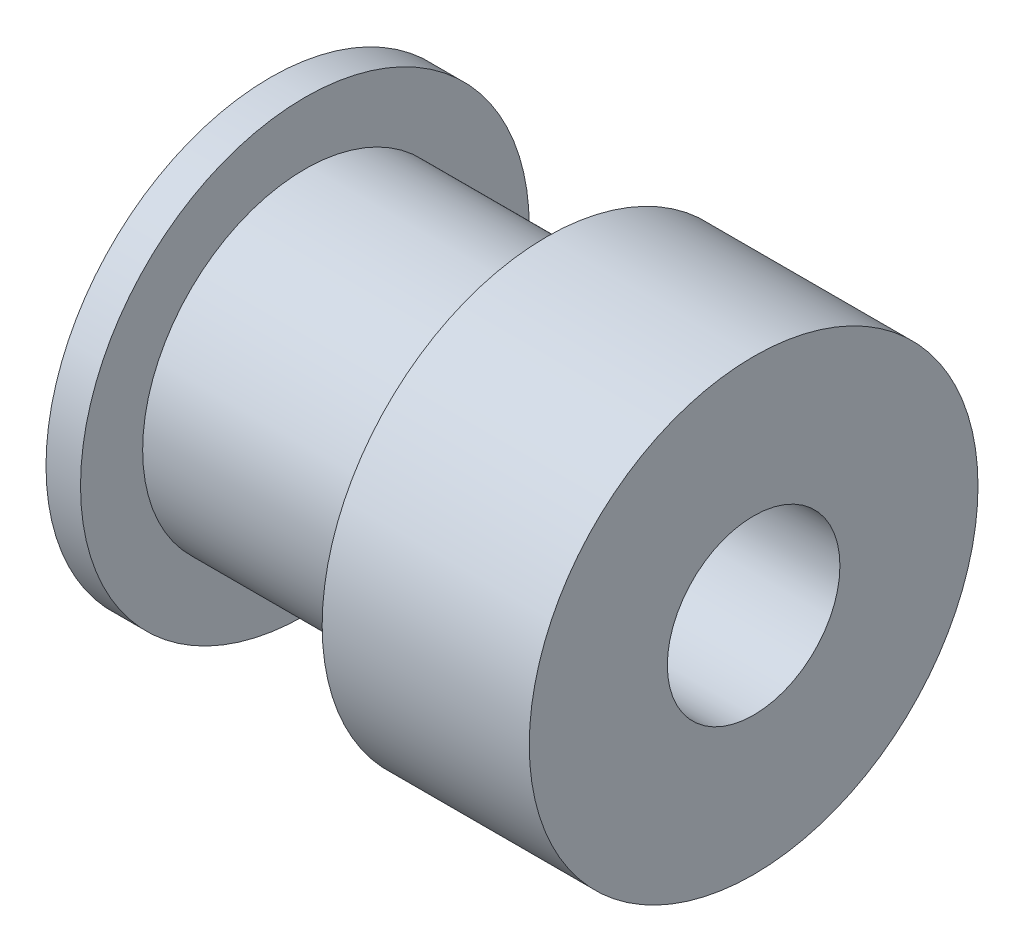
ISO-10303-21;
HEADER;
FILE_DESCRIPTION(('STEP AP214'),'2;1');
FILE_NAME('part.step','',(''),(''),'','','');
FILE_SCHEMA(('AUTOMOTIVE_DESIGN { 1 0 10303 214 1 1 1 1 }'));
ENDSEC;
DATA;
#1=APPLICATION_CONTEXT('core data for automotive mechanical design processes');
#2=APPLICATION_PROTOCOL_DEFINITION('international standard','automotive_design',2000,#1);
#3=PRODUCT_CONTEXT('',#1,'mechanical');
#4=PRODUCT('Part','Part','',(#3));
#5=PRODUCT_RELATED_PRODUCT_CATEGORY('part','',(#4));
#6=PRODUCT_DEFINITION_FORMATION('','',#4);
#7=PRODUCT_DEFINITION_CONTEXT('part definition',#1,'design');
#8=PRODUCT_DEFINITION('design','',#6,#7);
#9=PRODUCT_DEFINITION_SHAPE('','',#8);
#10=(LENGTH_UNIT() NAMED_UNIT(*) SI_UNIT(.MILLI.,.METRE.));
#11=(NAMED_UNIT(*) PLANE_ANGLE_UNIT() SI_UNIT($,.RADIAN.));
#12=(NAMED_UNIT(*) SI_UNIT($,.STERADIAN.) SOLID_ANGLE_UNIT());
#13=UNCERTAINTY_MEASURE_WITH_UNIT(LENGTH_MEASURE(1.E-05),#10,'distance_accuracy_value','');
#14=(GEOMETRIC_REPRESENTATION_CONTEXT(3) GLOBAL_UNCERTAINTY_ASSIGNED_CONTEXT((#13)) GLOBAL_UNIT_ASSIGNED_CONTEXT((#10,
#11,#12)) REPRESENTATION_CONTEXT('',''));
#15=CARTESIAN_POINT('',(0.,0.,0.));
#16=DIRECTION('',(0.,0.,1.));
#17=DIRECTION('',(1.,0.,0.));
#18=AXIS2_PLACEMENT_3D('',#15,#16,#17);
#19=CARTESIAN_POINT('',(0.,0.,0.));
#20=DIRECTION('',(-1.,0.,0.));
#21=DIRECTION('',(0.,0.,1.));
#22=AXIS2_PLACEMENT_3D('',#19,#20,#21);
#23=CYLINDRICAL_SURFACE('',#22,4.7);
#24=CARTESIAN_POINT('',(8.,0.,0.));
#25=DIRECTION('',(-1.,0.,0.));
#26=DIRECTION('',(0.,0.,1.));
#27=AXIS2_PLACEMENT_3D('',#24,#25,#26);
#28=CIRCLE('',#27,4.7);
#29=CARTESIAN_POINT('',(8.,0.,4.7));
#30=VERTEX_POINT('',#29);
#31=EDGE_CURVE('E71',#30,#30,#28,.T.);
#32=ORIENTED_EDGE('',*,*,#31,.T.);
#33=EDGE_LOOP('',(#32));
#34=FACE_BOUND('',#33,.T.);
#35=CARTESIAN_POINT('',(1.,0.,0.));
#36=DIRECTION('',(-1.,0.,0.));
#37=DIRECTION('',(0.,0.,1.));
#38=AXIS2_PLACEMENT_3D('',#35,#36,#37);
#39=CIRCLE('',#38,4.7);
#40=CARTESIAN_POINT('',(1.,0.,4.7));
#41=VERTEX_POINT('',#40);
#42=EDGE_CURVE('E10',#41,#41,#39,.T.);
#43=ORIENTED_EDGE('',*,*,#42,.F.);
#44=EDGE_LOOP('',(#43));
#45=FACE_BOUND('',#44,.T.);
#46=ADVANCED_FACE('F36',(#34,#45),#23,.T.);
#47=CARTESIAN_POINT('',(1.,-6.5,0.));
#48=DIRECTION('',(1.,0.,0.));
#49=DIRECTION('',(0.,0.,-1.));
#50=AXIS2_PLACEMENT_3D('',#47,#48,#49);
#51=PLANE('',#50);
#52=ORIENTED_EDGE('',*,*,#42,.T.);
#53=EDGE_LOOP('',(#52));
#54=FACE_BOUND('',#53,.T.);
#55=CARTESIAN_POINT('',(1.,0.,0.));
#56=DIRECTION('',(-1.,0.,0.));
#57=DIRECTION('',(0.,0.,1.));
#58=AXIS2_PLACEMENT_3D('',#55,#56,#57);
#59=CIRCLE('',#58,6.5);
#60=CARTESIAN_POINT('',(1.,0.,6.5));
#61=VERTEX_POINT('',#60);
#62=EDGE_CURVE('E43',#61,#61,#59,.T.);
#63=ORIENTED_EDGE('',*,*,#62,.F.);
#64=EDGE_LOOP('',(#63));
#65=FACE_BOUND('',#64,.T.);
#66=ADVANCED_FACE('F90',(#54,#65),#51,.T.);
#67=CARTESIAN_POINT('',(0.,0.,0.));
#68=DIRECTION('',(-1.,0.,0.));
#69=DIRECTION('',(0.,0.,1.));
#70=AXIS2_PLACEMENT_3D('',#67,#68,#69);
#71=CYLINDRICAL_SURFACE('',#70,6.5);
#72=ORIENTED_EDGE('',*,*,#62,.T.);
#73=EDGE_LOOP('',(#72));
#74=FACE_BOUND('',#73,.T.);
#75=CARTESIAN_POINT('',(0.,0.,0.));
#76=DIRECTION('',(-1.,0.,0.));
#77=DIRECTION('',(0.,0.,1.));
#78=AXIS2_PLACEMENT_3D('',#75,#76,#77);
#79=CIRCLE('',#78,6.5);
#80=CARTESIAN_POINT('',(0.,0.,6.5));
#81=VERTEX_POINT('',#80);
#82=EDGE_CURVE('E48',#81,#81,#79,.T.);
#83=ORIENTED_EDGE('',*,*,#82,.F.);
#84=EDGE_LOOP('',(#83));
#85=FACE_BOUND('',#84,.T.);
#86=ADVANCED_FACE('F94',(#74,#85),#71,.T.);
#87=CARTESIAN_POINT('',(0.,-2.5,0.));
#88=DIRECTION('',(-1.,0.,0.));
#89=DIRECTION('',(0.,0.,1.));
#90=AXIS2_PLACEMENT_3D('',#87,#88,#89);
#91=PLANE('',#90);
#92=ORIENTED_EDGE('',*,*,#82,.T.);
#93=EDGE_LOOP('',(#92));
#94=FACE_BOUND('',#93,.T.);
#95=CARTESIAN_POINT('',(0.,0.,0.));
#96=DIRECTION('',(-1.,0.,0.));
#97=DIRECTION('',(0.,0.,1.));
#98=AXIS2_PLACEMENT_3D('',#95,#96,#97);
#99=CIRCLE('',#98,2.5);
#100=CARTESIAN_POINT('',(0.,0.,2.5));
#101=VERTEX_POINT('',#100);
#102=EDGE_CURVE('E53',#101,#101,#99,.T.);
#103=ORIENTED_EDGE('',*,*,#102,.F.);
#104=EDGE_LOOP('',(#103));
#105=FACE_BOUND('',#104,.T.);
#106=ADVANCED_FACE('F98',(#94,#105),#91,.T.);
#107=CARTESIAN_POINT('',(0.,0.,0.));
#108=DIRECTION('',(-1.,0.,0.));
#109=DIRECTION('',(0.,0.,1.));
#110=AXIS2_PLACEMENT_3D('',#107,#108,#109);
#111=CYLINDRICAL_SURFACE('',#110,2.5);
#112=ORIENTED_EDGE('',*,*,#102,.T.);
#113=EDGE_LOOP('',(#112));
#114=FACE_BOUND('',#113,.T.);
#115=CARTESIAN_POINT('',(14.,0.,0.));
#116=DIRECTION('',(-1.,0.,0.));
#117=DIRECTION('',(0.,0.,1.));
#118=AXIS2_PLACEMENT_3D('',#115,#116,#117);
#119=CIRCLE('',#118,2.5);
#120=CARTESIAN_POINT('',(14.,0.,2.5));
#121=VERTEX_POINT('',#120);
#122=EDGE_CURVE('E59',#121,#121,#119,.T.);
#123=ORIENTED_EDGE('',*,*,#122,.F.);
#124=EDGE_LOOP('',(#123));
#125=FACE_BOUND('',#124,.T.);
#126=ADVANCED_FACE('F104',(#114,#125),#111,.F.);
#127=CARTESIAN_POINT('',(14.,-2.5,0.));
#128=DIRECTION('',(1.,0.,0.));
#129=DIRECTION('',(0.,0.,-1.));
#130=AXIS2_PLACEMENT_3D('',#127,#128,#129);
#131=PLANE('',#130);
#132=ORIENTED_EDGE('',*,*,#122,.T.);
#133=EDGE_LOOP('',(#132));
#134=FACE_BOUND('',#133,.T.);
#135=CARTESIAN_POINT('',(14.,0.,0.));
#136=DIRECTION('',(-1.,0.,0.));
#137=DIRECTION('',(0.,0.,1.));
#138=AXIS2_PLACEMENT_3D('',#135,#136,#137);
#139=CIRCLE('',#138,6.5);
#140=CARTESIAN_POINT('',(14.,0.,6.5));
#141=VERTEX_POINT('',#140);
#142=EDGE_CURVE('E63',#141,#141,#139,.T.);
#143=ORIENTED_EDGE('',*,*,#142,.F.);
#144=EDGE_LOOP('',(#143));
#145=FACE_BOUND('',#144,.T.);
#146=ADVANCED_FACE('F86',(#134,#145),#131,.T.);
#147=CARTESIAN_POINT('',(0.,0.,0.));
#148=DIRECTION('',(-1.,0.,0.));
#149=DIRECTION('',(0.,0.,1.));
#150=AXIS2_PLACEMENT_3D('',#147,#148,#149);
#151=CYLINDRICAL_SURFACE('',#150,6.5);
#152=ORIENTED_EDGE('',*,*,#142,.T.);
#153=EDGE_LOOP('',(#152));
#154=FACE_BOUND('',#153,.T.);
#155=CARTESIAN_POINT('',(8.,0.,0.));
#156=DIRECTION('',(-1.,0.,0.));
#157=DIRECTION('',(0.,0.,1.));
#158=AXIS2_PLACEMENT_3D('',#155,#156,#157);
#159=CIRCLE('',#158,6.5);
#160=CARTESIAN_POINT('',(8.,0.,6.5));
#161=VERTEX_POINT('',#160);
#162=EDGE_CURVE('E67',#161,#161,#159,.T.);
#163=ORIENTED_EDGE('',*,*,#162,.F.);
#164=EDGE_LOOP('',(#163));
#165=FACE_BOUND('',#164,.T.);
#166=ADVANCED_FACE('F80',(#154,#165),#151,.T.);
#167=CARTESIAN_POINT('',(8.,-4.7,0.));
#168=DIRECTION('',(-1.,0.,0.));
#169=DIRECTION('',(0.,0.,1.));
#170=AXIS2_PLACEMENT_3D('',#167,#168,#169);
#171=PLANE('',#170);
#172=ORIENTED_EDGE('',*,*,#162,.T.);
#173=EDGE_LOOP('',(#172));
#174=FACE_BOUND('',#173,.T.);
#175=ORIENTED_EDGE('',*,*,#31,.F.);
#176=EDGE_LOOP('',(#175));
#177=FACE_BOUND('',#176,.T.);
#178=ADVANCED_FACE('F78',(#174,#177),#171,.T.);
#179=CLOSED_SHELL('',(#46,#66,#86,#106,#126,#146,#166,#178));
#180=MANIFOLD_SOLID_BREP('B2',#179);
#181=ADVANCED_BREP_SHAPE_REPRESENTATION('',(#18,#180),#14);
#182=SHAPE_DEFINITION_REPRESENTATION(#9,#181);
ENDSEC;
END-ISO-10303-21;
